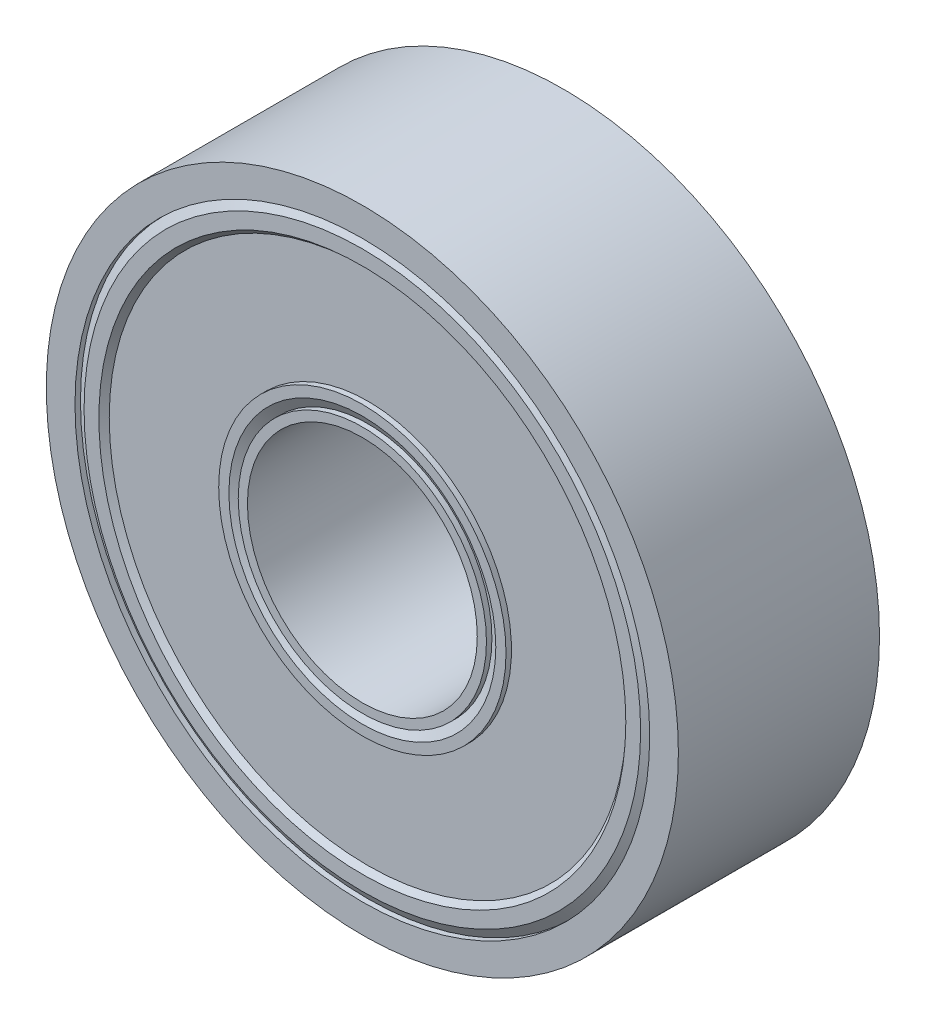
ISO-10303-21;
HEADER;
FILE_DESCRIPTION(('STEP AP214'),'2;1');
FILE_NAME('part.step','',(''),(''),'','','');
FILE_SCHEMA(('AUTOMOTIVE_DESIGN { 1 0 10303 214 1 1 1 1 }'));
ENDSEC;
DATA;
#1=APPLICATION_CONTEXT('core data for automotive mechanical design processes');
#2=APPLICATION_PROTOCOL_DEFINITION('international standard','automotive_design',2000,#1);
#3=PRODUCT_CONTEXT('',#1,'mechanical');
#4=PRODUCT('Part','Part','',(#3));
#5=PRODUCT_RELATED_PRODUCT_CATEGORY('part','',(#4));
#6=PRODUCT_DEFINITION_FORMATION('','',#4);
#7=PRODUCT_DEFINITION_CONTEXT('part definition',#1,'design');
#8=PRODUCT_DEFINITION('design','',#6,#7);
#9=PRODUCT_DEFINITION_SHAPE('','',#8);
#10=(LENGTH_UNIT() NAMED_UNIT(*) SI_UNIT(.MILLI.,.METRE.));
#11=(NAMED_UNIT(*) PLANE_ANGLE_UNIT() SI_UNIT($,.RADIAN.));
#12=(NAMED_UNIT(*) SI_UNIT($,.STERADIAN.) SOLID_ANGLE_UNIT());
#13=UNCERTAINTY_MEASURE_WITH_UNIT(LENGTH_MEASURE(1.E-05),#10,'distance_accuracy_value','');
#14=(GEOMETRIC_REPRESENTATION_CONTEXT(3) GLOBAL_UNCERTAINTY_ASSIGNED_CONTEXT((#13)) GLOBAL_UNIT_ASSIGNED_CONTEXT((#10,
#11,#12)) REPRESENTATION_CONTEXT('',''));
#15=CARTESIAN_POINT('',(0.,0.,0.));
#16=DIRECTION('',(0.,0.,1.));
#17=DIRECTION('',(1.,0.,0.));
#18=AXIS2_PLACEMENT_3D('',#15,#16,#17);
#19=CARTESIAN_POINT('',(0.,0.,7.));
#20=DIRECTION('',(0.,0.,1.));
#21=DIRECTION('',(1.,0.,0.));
#22=AXIS2_PLACEMENT_3D('',#19,#20,#21);
#23=PLANE('',#22);
#24=CARTESIAN_POINT('',(0.,0.,7.));
#25=DIRECTION('',(0.,0.,-1.));
#26=DIRECTION('',(-1.,0.,0.));
#27=AXIS2_PLACEMENT_3D('',#24,#25,#26);
#28=CIRCLE('',#27,4.31974076568247);
#29=CARTESIAN_POINT('',(-4.31974076568247,0.,7.));
#30=VERTEX_POINT('',#29);
#31=EDGE_CURVE('E136',#30,#30,#28,.T.);
#32=ORIENTED_EDGE('',*,*,#31,.F.);
#33=EDGE_LOOP('',(#32));
#34=FACE_BOUND('',#33,.T.);
#35=CARTESIAN_POINT('',(0.,0.,7.));
#36=DIRECTION('',(0.,0.,1.));
#37=DIRECTION('',(1.,0.,0.));
#38=AXIS2_PLACEMENT_3D('',#35,#36,#37);
#39=CIRCLE('',#38,4.);
#40=CARTESIAN_POINT('',(4.,0.,7.));
#41=VERTEX_POINT('',#40);
#42=EDGE_CURVE('E56',#41,#41,#39,.T.);
#43=ORIENTED_EDGE('',*,*,#42,.F.);
#44=EDGE_LOOP('',(#43));
#45=FACE_BOUND('',#44,.T.);
#46=ADVANCED_FACE('F41',(#34,#45),#23,.T.);
#47=CARTESIAN_POINT('',(0.,0.,0.));
#48=DIRECTION('',(0.,0.,1.));
#49=DIRECTION('',(1.,0.,0.));
#50=AXIS2_PLACEMENT_3D('',#47,#48,#49);
#51=PLANE('',#50);
#52=CARTESIAN_POINT('',(0.,0.,0.));
#53=DIRECTION('',(0.,0.,-1.));
#54=DIRECTION('',(-1.,0.,0.));
#55=AXIS2_PLACEMENT_3D('',#52,#53,#54);
#56=CIRCLE('',#55,4.31974076568247);
#57=CARTESIAN_POINT('',(-4.31974076568247,0.,0.));
#58=VERTEX_POINT('',#57);
#59=EDGE_CURVE('E109',#58,#58,#56,.T.);
#60=ORIENTED_EDGE('',*,*,#59,.T.);
#61=EDGE_LOOP('',(#60));
#62=FACE_BOUND('',#61,.T.);
#63=CARTESIAN_POINT('',(0.,0.,0.));
#64=DIRECTION('',(0.,0.,1.));
#65=DIRECTION('',(1.,0.,0.));
#66=AXIS2_PLACEMENT_3D('',#63,#64,#65);
#67=CIRCLE('',#66,4.);
#68=CARTESIAN_POINT('',(4.,0.,0.));
#69=VERTEX_POINT('',#68);
#70=EDGE_CURVE('E59',#69,#69,#67,.T.);
#71=ORIENTED_EDGE('',*,*,#70,.T.);
#72=EDGE_LOOP('',(#71));
#73=FACE_BOUND('',#72,.T.);
#74=ADVANCED_FACE('F171',(#62,#73),#51,.F.);
#75=CARTESIAN_POINT('',(0.,0.,7.));
#76=DIRECTION('',(0.,0.,-1.));
#77=DIRECTION('',(-1.,0.,0.));
#78=AXIS2_PLACEMENT_3D('',#75,#76,#77);
#79=CYLINDRICAL_SURFACE('',#78,4.);
#80=ORIENTED_EDGE('',*,*,#42,.T.);
#81=EDGE_LOOP('',(#80));
#82=FACE_BOUND('',#81,.T.);
#83=ORIENTED_EDGE('',*,*,#70,.F.);
#84=EDGE_LOOP('',(#83));
#85=FACE_BOUND('',#84,.T.);
#86=ADVANCED_FACE('F179',(#82,#85),#79,.F.);
#87=CARTESIAN_POINT('',(0.,0.,0.));
#88=DIRECTION('',(0.,0.,-1.));
#89=DIRECTION('',(-1.,0.,0.));
#90=AXIS2_PLACEMENT_3D('',#87,#88,#89);
#91=CONICAL_SURFACE('',#90,4.64518535496171,1.04087933588519);
#92=CARTESIAN_POINT('',(0.,0.,0.190647234255025));
#93=DIRECTION('',(0.,0.,-1.));
#94=DIRECTION('',(-1.,0.,0.));
#95=AXIS2_PLACEMENT_3D('',#92,#93,#94);
#96=CIRCLE('',#95,4.31974076568247);
#97=CARTESIAN_POINT('',(-4.31974076568247,0.,0.190647234255025));
#98=VERTEX_POINT('',#97);
#99=EDGE_CURVE('E104',#98,#98,#96,.T.);
#100=ORIENTED_EDGE('',*,*,#99,.F.);
#101=EDGE_LOOP('',(#100));
#102=FACE_BOUND('',#101,.T.);
#103=CARTESIAN_POINT('',(0.,0.,0.));
#104=DIRECTION('',(0.,0.,-1.));
#105=DIRECTION('',(-1.,0.,0.));
#106=AXIS2_PLACEMENT_3D('',#103,#104,#105);
#107=CIRCLE('',#106,4.64518535496171);
#108=CARTESIAN_POINT('',(-4.64518535496171,0.,0.));
#109=VERTEX_POINT('',#108);
#110=EDGE_CURVE('E125',#109,#109,#107,.T.);
#111=ORIENTED_EDGE('',*,*,#110,.T.);
#112=EDGE_LOOP('',(#111));
#113=FACE_BOUND('',#112,.T.);
#114=ADVANCED_FACE('F222',(#102,#113),#91,.F.);
#115=CARTESIAN_POINT('',(0.,0.,0.));
#116=DIRECTION('',(0.,0.,-1.));
#117=DIRECTION('',(-1.,0.,0.));
#118=AXIS2_PLACEMENT_3D('',#115,#116,#117);
#119=CYLINDRICAL_SURFACE('',#118,4.31974076568247);
#120=ORIENTED_EDGE('',*,*,#59,.F.);
#121=EDGE_LOOP('',(#120));
#122=FACE_BOUND('',#121,.T.);
#123=ORIENTED_EDGE('',*,*,#99,.T.);
#124=EDGE_LOOP('',(#123));
#125=FACE_BOUND('',#124,.T.);
#126=ADVANCED_FACE('F216',(#122,#125),#119,.T.);
#127=CARTESIAN_POINT('',(0.,0.,6.80935276574498));
#128=DIRECTION('',(0.,0.,1.));
#129=DIRECTION('',(1.,0.,0.));
#130=AXIS2_PLACEMENT_3D('',#127,#128,#129);
#131=CONICAL_SURFACE('',#130,4.31974076568247,1.04087933588519);
#132=CARTESIAN_POINT('',(0.,0.,7.));
#133=DIRECTION('',(0.,0.,-1.));
#134=DIRECTION('',(-1.,0.,0.));
#135=AXIS2_PLACEMENT_3D('',#132,#133,#134);
#136=CIRCLE('',#135,4.64518535496171);
#137=CARTESIAN_POINT('',(-4.64518535496171,0.,7.));
#138=VERTEX_POINT('',#137);
#139=EDGE_CURVE('E67',#138,#138,#136,.T.);
#140=ORIENTED_EDGE('',*,*,#139,.F.);
#141=EDGE_LOOP('',(#140));
#142=FACE_BOUND('',#141,.T.);
#143=CARTESIAN_POINT('',(0.,0.,6.80935276574498));
#144=DIRECTION('',(0.,0.,-1.));
#145=DIRECTION('',(-1.,0.,0.));
#146=AXIS2_PLACEMENT_3D('',#143,#144,#145);
#147=CIRCLE('',#146,4.31974076568247);
#148=CARTESIAN_POINT('',(-4.31974076568247,0.,6.80935276574498));
#149=VERTEX_POINT('',#148);
#150=EDGE_CURVE('E132',#149,#149,#147,.T.);
#151=ORIENTED_EDGE('',*,*,#150,.T.);
#152=EDGE_LOOP('',(#151));
#153=FACE_BOUND('',#152,.T.);
#154=ADVANCED_FACE('F208',(#142,#153),#131,.F.);
#155=CARTESIAN_POINT('',(0.,0.,0.));
#156=DIRECTION('',(0.,0.,-1.));
#157=DIRECTION('',(-1.,0.,0.));
#158=AXIS2_PLACEMENT_3D('',#155,#156,#157);
#159=CYLINDRICAL_SURFACE('',#158,4.31974076568247);
#160=ORIENTED_EDGE('',*,*,#150,.F.);
#161=EDGE_LOOP('',(#160));
#162=FACE_BOUND('',#161,.T.);
#163=ORIENTED_EDGE('',*,*,#31,.T.);
#164=EDGE_LOOP('',(#163));
#165=FACE_BOUND('',#164,.T.);
#166=ADVANCED_FACE('F200',(#162,#165),#159,.T.);
#167=CARTESIAN_POINT('',(0.,0.,7.));
#168=DIRECTION('',(0.,0.,1.));
#169=DIRECTION('',(1.,0.,0.));
#170=AXIS2_PLACEMENT_3D('',#167,#168,#169);
#171=CIRCLE('',#170,5.);
#172=CARTESIAN_POINT('',(5.,0.,7.));
#173=VERTEX_POINT('',#172);
#174=EDGE_CURVE('E45',#173,#173,#171,.F.);
#175=ORIENTED_EDGE('',*,*,#174,.F.);
#176=EDGE_LOOP('',(#175));
#177=FACE_BOUND('',#176,.T.);
#178=ORIENTED_EDGE('',*,*,#139,.T.);
#179=EDGE_LOOP('',(#178));
#180=FACE_BOUND('',#179,.T.);
#181=ADVANCED_FACE('F187',(#177,#180),#23,.T.);
#182=CARTESIAN_POINT('',(0.,0.,0.));
#183=DIRECTION('',(0.,0.,1.));
#184=DIRECTION('',(1.,0.,0.));
#185=AXIS2_PLACEMENT_3D('',#182,#183,#184);
#186=CIRCLE('',#185,5.);
#187=CARTESIAN_POINT('',(5.,0.,0.));
#188=VERTEX_POINT('',#187);
#189=EDGE_CURVE('E62',#188,#188,#186,.F.);
#190=ORIENTED_EDGE('',*,*,#189,.T.);
#191=EDGE_LOOP('',(#190));
#192=FACE_BOUND('',#191,.T.);
#193=ORIENTED_EDGE('',*,*,#110,.F.);
#194=EDGE_LOOP('',(#193));
#195=FACE_BOUND('',#194,.T.);
#196=ADVANCED_FACE('F167',(#192,#195),#51,.F.);
#197=CARTESIAN_POINT('',(0.,0.,-0.202353914038367));
#198=DIRECTION('',(0.,0.,-1.));
#199=DIRECTION('',(-1.,0.,0.));
#200=AXIS2_PLACEMENT_3D('',#197,#198,#199);
#201=CONICAL_SURFACE('',#200,9.35057170829082,0.728398396711496);
#202=CARTESIAN_POINT('',(0.,0.,0.190647234255025));
#203=DIRECTION('',(0.,0.,-1.));
#204=DIRECTION('',(-1.,0.,0.));
#205=AXIS2_PLACEMENT_3D('',#202,#203,#204);
#206=CIRCLE('',#205,9.);
#207=CARTESIAN_POINT('',(-9.,0.,0.190647234255025));
#208=VERTEX_POINT('',#207);
#209=EDGE_CURVE('E117',#208,#208,#206,.T.);
#210=ORIENTED_EDGE('',*,*,#209,.F.);
#211=EDGE_LOOP('',(#210));
#212=FACE_BOUND('',#211,.T.);
#213=CARTESIAN_POINT('',(0.,0.,0.));
#214=DIRECTION('',(0.,0.,1.));
#215=DIRECTION('',(1.,0.,0.));
#216=AXIS2_PLACEMENT_3D('',#213,#214,#215);
#217=CIRCLE('',#216,9.17006445625906);
#218=CARTESIAN_POINT('',(9.17006445625906,0.,0.));
#219=VERTEX_POINT('',#218);
#220=EDGE_CURVE('E66',#219,#219,#217,.T.);
#221=ORIENTED_EDGE('',*,*,#220,.F.);
#222=EDGE_LOOP('',(#221));
#223=FACE_BOUND('',#222,.T.);
#224=ADVANCED_FACE('F206',(#212,#223),#201,.F.);
#225=CARTESIAN_POINT('',(-9.,0.,0.190647234255025));
#226=DIRECTION('',(0.,0.,1.));
#227=DIRECTION('',(1.,0.,0.));
#228=AXIS2_PLACEMENT_3D('',#225,#226,#227);
#229=PLANE('',#228);
#230=CARTESIAN_POINT('',(0.,0.,0.190647234255025));
#231=DIRECTION('',(0.,0.,-1.));
#232=DIRECTION('',(-1.,0.,0.));
#233=AXIS2_PLACEMENT_3D('',#230,#231,#232);
#234=CIRCLE('',#233,5.);
#235=CARTESIAN_POINT('',(-5.,0.,0.190647234255025));
#236=VERTEX_POINT('',#235);
#237=EDGE_CURVE('E121',#236,#236,#234,.T.);
#238=ORIENTED_EDGE('',*,*,#237,.F.);
#239=EDGE_LOOP('',(#238));
#240=FACE_BOUND('',#239,.T.);
#241=ORIENTED_EDGE('',*,*,#209,.T.);
#242=EDGE_LOOP('',(#241));
#243=FACE_BOUND('',#242,.T.);
#244=ADVANCED_FACE('F357',(#240,#243),#229,.F.);
#245=CARTESIAN_POINT('',(0.,0.,0.));
#246=DIRECTION('',(0.,0.,-1.));
#247=DIRECTION('',(-1.,0.,0.));
#248=AXIS2_PLACEMENT_3D('',#245,#246,#247);
#249=CYLINDRICAL_SURFACE('',#248,5.);
#250=ORIENTED_EDGE('',*,*,#237,.T.);
#251=EDGE_LOOP('',(#250));
#252=FACE_BOUND('',#251,.T.);
#253=ORIENTED_EDGE('',*,*,#189,.F.);
#254=EDGE_LOOP('',(#253));
#255=FACE_BOUND('',#254,.T.);
#256=ADVANCED_FACE('F295',(#252,#255),#249,.T.);
#257=CARTESIAN_POINT('',(0.,0.,0.));
#258=DIRECTION('',(0.,0.,1.));
#259=DIRECTION('',(1.,0.,0.));
#260=AXIS2_PLACEMENT_3D('',#257,#258,#259);
#261=CIRCLE('',#260,9.68571060917821);
#262=CARTESIAN_POINT('',(9.68571060917821,0.,0.));
#263=VERTEX_POINT('',#262);
#264=EDGE_CURVE('E71',#263,#263,#261,.F.);
#265=ORIENTED_EDGE('',*,*,#264,.T.);
#266=EDGE_LOOP('',(#265));
#267=FACE_BOUND('',#266,.T.);
#268=ORIENTED_EDGE('',*,*,#220,.T.);
#269=EDGE_LOOP('',(#268));
#270=FACE_BOUND('',#269,.T.);
#271=ADVANCED_FACE('F166',(#267,#270),#51,.F.);
#272=CARTESIAN_POINT('',(0.,0.,0.));
#273=DIRECTION('',(0.,0.,-1.));
#274=DIRECTION('',(-1.,0.,0.));
#275=AXIS2_PLACEMENT_3D('',#272,#273,#274);
#276=CYLINDRICAL_SURFACE('',#275,10.0014608868493);
#277=CARTESIAN_POINT('',(0.,0.,0.190647234255025));
#278=DIRECTION('',(0.,0.,-1.));
#279=DIRECTION('',(-1.,0.,0.));
#280=AXIS2_PLACEMENT_3D('',#277,#278,#279);
#281=CIRCLE('',#280,10.0014608868493);
#282=CARTESIAN_POINT('',(-10.0014608868493,0.,0.190647234255025));
#283=VERTEX_POINT('',#282);
#284=EDGE_CURVE('E113',#283,#283,#281,.T.);
#285=ORIENTED_EDGE('',*,*,#284,.F.);
#286=EDGE_LOOP('',(#285));
#287=FACE_BOUND('',#286,.T.);
#288=CARTESIAN_POINT('',(0.,0.,0.));
#289=DIRECTION('',(0.,0.,1.));
#290=DIRECTION('',(1.,0.,0.));
#291=AXIS2_PLACEMENT_3D('',#288,#289,#290);
#292=CIRCLE('',#291,10.0014608868493);
#293=CARTESIAN_POINT('',(10.0014608868493,0.,0.));
#294=VERTEX_POINT('',#293);
#295=EDGE_CURVE('E75',#294,#294,#292,.T.);
#296=ORIENTED_EDGE('',*,*,#295,.F.);
#297=EDGE_LOOP('',(#296));
#298=FACE_BOUND('',#297,.T.);
#299=ADVANCED_FACE('F196',(#287,#298),#276,.F.);
#300=CARTESIAN_POINT('',(0.,0.,0.190647234255025));
#301=DIRECTION('',(0.,0.,1.));
#302=DIRECTION('',(1.,0.,0.));
#303=AXIS2_PLACEMENT_3D('',#300,#301,#302);
#304=CONICAL_SURFACE('',#303,10.0014608868493,1.02759385259164);
#305=ORIENTED_EDGE('',*,*,#284,.T.);
#306=EDGE_LOOP('',(#305));
#307=FACE_BOUND('',#306,.T.);
#308=ORIENTED_EDGE('',*,*,#264,.F.);
#309=EDGE_LOOP('',(#308));
#310=FACE_BOUND('',#309,.T.);
#311=ADVANCED_FACE('F189',(#307,#310),#304,.T.);
#312=CARTESIAN_POINT('',(0.,0.,7.));
#313=DIRECTION('',(0.,0.,1.));
#314=DIRECTION('',(1.,0.,0.));
#315=AXIS2_PLACEMENT_3D('',#312,#313,#314);
#316=CIRCLE('',#315,10.0014608868493);
#317=CARTESIAN_POINT('',(10.0014608868493,0.,7.));
#318=VERTEX_POINT('',#317);
#319=EDGE_CURVE('E86',#318,#318,#316,.T.);
#320=ORIENTED_EDGE('',*,*,#319,.F.);
#321=EDGE_LOOP('',(#320));
#322=FACE_BOUND('',#321,.T.);
#323=CARTESIAN_POINT('',(0.,0.,7.));
#324=DIRECTION('',(0.,0.,1.));
#325=DIRECTION('',(1.,0.,0.));
#326=AXIS2_PLACEMENT_3D('',#323,#324,#325);
#327=CIRCLE('',#326,11.);
#328=CARTESIAN_POINT('',(11.,0.,7.));
#329=VERTEX_POINT('',#328);
#330=EDGE_CURVE('E10',#329,#329,#327,.T.);
#331=ORIENTED_EDGE('',*,*,#330,.T.);
#332=EDGE_LOOP('',(#331));
#333=FACE_BOUND('',#332,.T.);
#334=ADVANCED_FACE('F175',(#322,#333),#23,.T.);
#335=CARTESIAN_POINT('',(0.,0.,7.));
#336=DIRECTION('',(0.,0.,-1.));
#337=DIRECTION('',(-1.,0.,0.));
#338=AXIS2_PLACEMENT_3D('',#335,#336,#337);
#339=CYLINDRICAL_SURFACE('',#338,11.);
#340=ORIENTED_EDGE('',*,*,#330,.F.);
#341=EDGE_LOOP('',(#340));
#342=FACE_BOUND('',#341,.T.);
#343=CARTESIAN_POINT('',(0.,0.,0.));
#344=DIRECTION('',(0.,0.,1.));
#345=DIRECTION('',(1.,0.,0.));
#346=AXIS2_PLACEMENT_3D('',#343,#344,#345);
#347=CIRCLE('',#346,11.);
#348=CARTESIAN_POINT('',(11.,0.,0.));
#349=VERTEX_POINT('',#348);
#350=EDGE_CURVE('E50',#349,#349,#347,.T.);
#351=ORIENTED_EDGE('',*,*,#350,.T.);
#352=EDGE_LOOP('',(#351));
#353=FACE_BOUND('',#352,.T.);
#354=ADVANCED_FACE('F43',(#342,#353),#339,.T.);
#355=ORIENTED_EDGE('',*,*,#295,.T.);
#356=EDGE_LOOP('',(#355));
#357=FACE_BOUND('',#356,.T.);
#358=ORIENTED_EDGE('',*,*,#350,.F.);
#359=EDGE_LOOP('',(#358));
#360=FACE_BOUND('',#359,.T.);
#361=ADVANCED_FACE('F156',(#357,#360),#51,.F.);
#362=CARTESIAN_POINT('',(0.,0.,0.));
#363=DIRECTION('',(0.,0.,-1.));
#364=DIRECTION('',(-1.,0.,0.));
#365=AXIS2_PLACEMENT_3D('',#362,#363,#364);
#366=CYLINDRICAL_SURFACE('',#365,5.);
#367=ORIENTED_EDGE('',*,*,#174,.T.);
#368=EDGE_LOOP('',(#367));
#369=FACE_BOUND('',#368,.T.);
#370=CARTESIAN_POINT('',(0.,0.,6.80935276574498));
#371=DIRECTION('',(0.,0.,-1.));
#372=DIRECTION('',(-1.,0.,0.));
#373=AXIS2_PLACEMENT_3D('',#370,#371,#372);
#374=CIRCLE('',#373,5.);
#375=CARTESIAN_POINT('',(-5.,0.,6.80935276574498));
#376=VERTEX_POINT('',#375);
#377=EDGE_CURVE('E108',#376,#376,#374,.T.);
#378=ORIENTED_EDGE('',*,*,#377,.F.);
#379=EDGE_LOOP('',(#378));
#380=FACE_BOUND('',#379,.T.);
#381=ADVANCED_FACE('F154',(#369,#380),#366,.T.);
#382=CARTESIAN_POINT('',(-9.,0.,6.80935276574498));
#383=DIRECTION('',(0.,0.,-1.));
#384=DIRECTION('',(-1.,0.,0.));
#385=AXIS2_PLACEMENT_3D('',#382,#383,#384);
#386=PLANE('',#385);
#387=CARTESIAN_POINT('',(0.,0.,6.80935276574498));
#388=DIRECTION('',(0.,0.,-1.));
#389=DIRECTION('',(-1.,0.,0.));
#390=AXIS2_PLACEMENT_3D('',#387,#388,#389);
#391=CIRCLE('',#390,9.);
#392=CARTESIAN_POINT('',(-9.,0.,6.80935276574498));
#393=VERTEX_POINT('',#392);
#394=EDGE_CURVE('E144',#393,#393,#391,.T.);
#395=ORIENTED_EDGE('',*,*,#394,.F.);
#396=EDGE_LOOP('',(#395));
#397=FACE_BOUND('',#396,.T.);
#398=ORIENTED_EDGE('',*,*,#377,.T.);
#399=EDGE_LOOP('',(#398));
#400=FACE_BOUND('',#399,.T.);
#401=ADVANCED_FACE('F152',(#397,#400),#386,.F.);
#402=CARTESIAN_POINT('',(0.,0.,6.80935276574498));
#403=DIRECTION('',(0.,0.,1.));
#404=DIRECTION('',(1.,0.,0.));
#405=AXIS2_PLACEMENT_3D('',#402,#403,#404);
#406=CONICAL_SURFACE('',#405,9.,0.728398396711496);
#407=CARTESIAN_POINT('',(0.,0.,7.));
#408=DIRECTION('',(0.,0.,1.));
#409=DIRECTION('',(1.,0.,0.));
#410=AXIS2_PLACEMENT_3D('',#407,#408,#409);
#411=CIRCLE('',#410,9.17006445625906);
#412=CARTESIAN_POINT('',(9.17006445625906,0.,7.));
#413=VERTEX_POINT('',#412);
#414=EDGE_CURVE('E79',#413,#413,#411,.T.);
#415=ORIENTED_EDGE('',*,*,#414,.T.);
#416=EDGE_LOOP('',(#415));
#417=FACE_BOUND('',#416,.T.);
#418=ORIENTED_EDGE('',*,*,#394,.T.);
#419=EDGE_LOOP('',(#418));
#420=FACE_BOUND('',#419,.T.);
#421=ADVANCED_FACE('F162',(#417,#420),#406,.F.);
#422=CARTESIAN_POINT('',(0.,0.,7.20235391403837));
#423=DIRECTION('',(0.,0.,-1.));
#424=DIRECTION('',(-1.,0.,0.));
#425=AXIS2_PLACEMENT_3D('',#422,#423,#424);
#426=CONICAL_SURFACE('',#425,9.35057170829082,1.02759385259164);
#427=CARTESIAN_POINT('',(0.,0.,7.));
#428=DIRECTION('',(0.,0.,1.));
#429=DIRECTION('',(1.,0.,0.));
#430=AXIS2_PLACEMENT_3D('',#427,#428,#429);
#431=CIRCLE('',#430,9.6857106091782);
#432=CARTESIAN_POINT('',(9.6857106091782,0.,7.));
#433=VERTEX_POINT('',#432);
#434=EDGE_CURVE('E83',#433,#433,#431,.F.);
#435=ORIENTED_EDGE('',*,*,#434,.T.);
#436=EDGE_LOOP('',(#435));
#437=FACE_BOUND('',#436,.T.);
#438=CARTESIAN_POINT('',(0.,0.,6.80935276574498));
#439=DIRECTION('',(0.,0.,-1.));
#440=DIRECTION('',(-1.,0.,0.));
#441=AXIS2_PLACEMENT_3D('',#438,#439,#440);
#442=CIRCLE('',#441,10.0014608868493);
#443=CARTESIAN_POINT('',(-10.0014608868493,0.,6.80935276574498));
#444=VERTEX_POINT('',#443);
#445=EDGE_CURVE('E140',#444,#444,#442,.T.);
#446=ORIENTED_EDGE('',*,*,#445,.F.);
#447=EDGE_LOOP('',(#446));
#448=FACE_BOUND('',#447,.T.);
#449=ADVANCED_FACE('F228',(#437,#448),#426,.T.);
#450=CARTESIAN_POINT('',(0.,0.,0.));
#451=DIRECTION('',(0.,0.,-1.));
#452=DIRECTION('',(-1.,0.,0.));
#453=AXIS2_PLACEMENT_3D('',#450,#451,#452);
#454=CYLINDRICAL_SURFACE('',#453,10.0014608868493);
#455=ORIENTED_EDGE('',*,*,#319,.T.);
#456=EDGE_LOOP('',(#455));
#457=FACE_BOUND('',#456,.T.);
#458=ORIENTED_EDGE('',*,*,#445,.T.);
#459=EDGE_LOOP('',(#458));
#460=FACE_BOUND('',#459,.T.);
#461=ADVANCED_FACE('F185',(#457,#460),#454,.F.);
#462=ORIENTED_EDGE('',*,*,#434,.F.);
#463=EDGE_LOOP('',(#462));
#464=FACE_BOUND('',#463,.T.);
#465=ORIENTED_EDGE('',*,*,#414,.F.);
#466=EDGE_LOOP('',(#465));
#467=FACE_BOUND('',#466,.T.);
#468=ADVANCED_FACE('F174',(#464,#467),#23,.T.);
#469=CLOSED_SHELL('',(#46,#74,#86,#114,#126,#154,#166,#181,#196,#224,#244,#256,#271,#299,#311,
#334,#354,#361,#381,#401,#421,#449,#461,#468));
#470=MANIFOLD_SOLID_BREP('B2',#469);
#471=ADVANCED_BREP_SHAPE_REPRESENTATION('',(#18,#470),#14);
#472=SHAPE_DEFINITION_REPRESENTATION(#9,#471);
ENDSEC;
END-ISO-10303-21;
